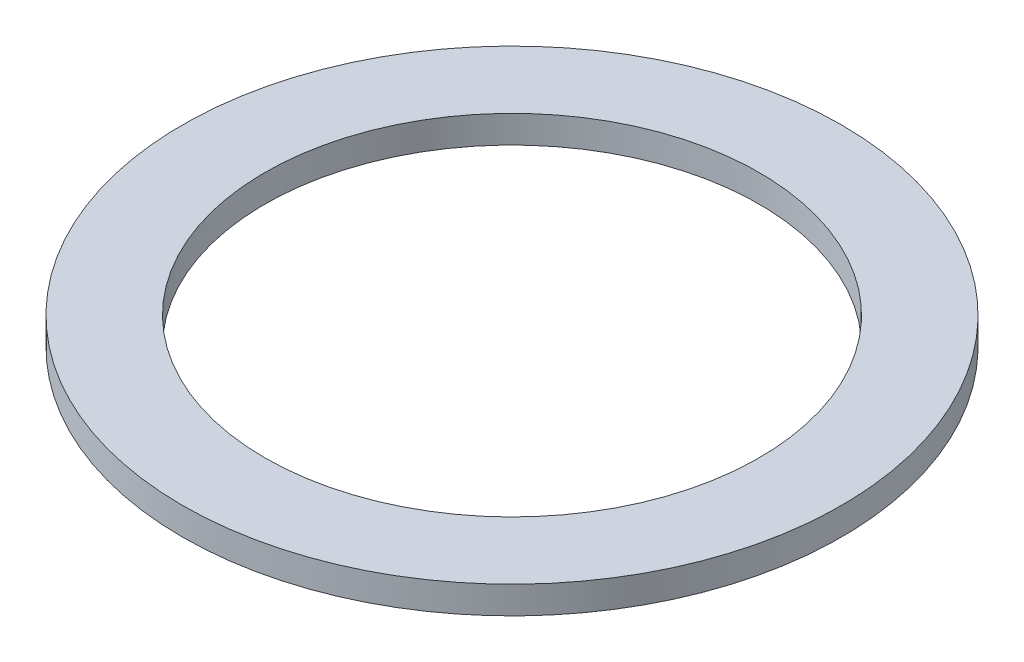
ISO-10303-21;
HEADER;
FILE_DESCRIPTION(('STEP AP214'),'2;1');
FILE_NAME('part.step','',(''),(''),'','','');
FILE_SCHEMA(('AUTOMOTIVE_DESIGN { 1 0 10303 214 1 1 1 1 }'));
ENDSEC;
DATA;
#1=APPLICATION_CONTEXT('core data for automotive mechanical design processes');
#2=APPLICATION_PROTOCOL_DEFINITION('international standard','automotive_design',2000,#1);
#3=PRODUCT_CONTEXT('',#1,'mechanical');
#4=PRODUCT('Part','Part','',(#3));
#5=PRODUCT_RELATED_PRODUCT_CATEGORY('part','',(#4));
#6=PRODUCT_DEFINITION_FORMATION('','',#4);
#7=PRODUCT_DEFINITION_CONTEXT('part definition',#1,'design');
#8=PRODUCT_DEFINITION('design','',#6,#7);
#9=PRODUCT_DEFINITION_SHAPE('','',#8);
#10=(LENGTH_UNIT() NAMED_UNIT(*) SI_UNIT(.MILLI.,.METRE.));
#11=(NAMED_UNIT(*) PLANE_ANGLE_UNIT() SI_UNIT($,.RADIAN.));
#12=(NAMED_UNIT(*) SI_UNIT($,.STERADIAN.) SOLID_ANGLE_UNIT());
#13=UNCERTAINTY_MEASURE_WITH_UNIT(LENGTH_MEASURE(1.E-05),#10,'distance_accuracy_value','');
#14=(GEOMETRIC_REPRESENTATION_CONTEXT(3) GLOBAL_UNCERTAINTY_ASSIGNED_CONTEXT((#13)) GLOBAL_UNIT_ASSIGNED_CONTEXT((#10,
#11,#12)) REPRESENTATION_CONTEXT('',''));
#15=CARTESIAN_POINT('',(0.,0.,0.));
#16=DIRECTION('',(0.,0.,1.));
#17=DIRECTION('',(1.,0.,0.));
#18=AXIS2_PLACEMENT_3D('',#15,#16,#17);
#19=CARTESIAN_POINT('',(0.,2.,0.));
#20=DIRECTION('',(0.,1.,0.));
#21=DIRECTION('',(0.,0.,1.));
#22=AXIS2_PLACEMENT_3D('',#19,#20,#21);
#23=PLANE('',#22);
#24=CARTESIAN_POINT('',(0.,2.,0.));
#25=DIRECTION('',(0.,1.,0.));
#26=DIRECTION('',(0.,0.,1.));
#27=AXIS2_PLACEMENT_3D('',#24,#25,#26);
#28=CIRCLE('',#27,24.);
#29=CARTESIAN_POINT('',(0.,2.,24.));
#30=VERTEX_POINT('',#29);
#31=EDGE_CURVE('E10',#30,#30,#28,.T.);
#32=ORIENTED_EDGE('',*,*,#31,.T.);
#33=EDGE_LOOP('',(#32));
#34=FACE_BOUND('',#33,.T.);
#35=CARTESIAN_POINT('',(0.,2.,0.));
#36=DIRECTION('',(0.,1.,0.));
#37=DIRECTION('',(0.,0.,1.));
#38=AXIS2_PLACEMENT_3D('',#35,#36,#37);
#39=CIRCLE('',#38,18.);
#40=CARTESIAN_POINT('',(0.,2.,18.));
#41=VERTEX_POINT('',#40);
#42=EDGE_CURVE('E43',#41,#41,#39,.T.);
#43=ORIENTED_EDGE('',*,*,#42,.F.);
#44=EDGE_LOOP('',(#43));
#45=FACE_BOUND('',#44,.T.);
#46=ADVANCED_FACE('F32',(#34,#45),#23,.T.);
#47=CARTESIAN_POINT('',(0.,0.,0.));
#48=DIRECTION('',(0.,1.,0.));
#49=DIRECTION('',(0.,0.,1.));
#50=AXIS2_PLACEMENT_3D('',#47,#48,#49);
#51=PLANE('',#50);
#52=CARTESIAN_POINT('',(0.,0.,0.));
#53=DIRECTION('',(0.,1.,0.));
#54=DIRECTION('',(0.,0.,1.));
#55=AXIS2_PLACEMENT_3D('',#52,#53,#54);
#56=CIRCLE('',#55,24.);
#57=CARTESIAN_POINT('',(0.,0.,24.));
#58=VERTEX_POINT('',#57);
#59=EDGE_CURVE('E36',#58,#58,#56,.T.);
#60=ORIENTED_EDGE('',*,*,#59,.F.);
#61=EDGE_LOOP('',(#60));
#62=FACE_BOUND('',#61,.T.);
#63=CARTESIAN_POINT('',(0.,0.,0.));
#64=DIRECTION('',(0.,1.,0.));
#65=DIRECTION('',(0.,0.,1.));
#66=AXIS2_PLACEMENT_3D('',#63,#64,#65);
#67=CIRCLE('',#66,18.);
#68=CARTESIAN_POINT('',(0.,0.,18.));
#69=VERTEX_POINT('',#68);
#70=EDGE_CURVE('E45',#69,#69,#67,.T.);
#71=ORIENTED_EDGE('',*,*,#70,.T.);
#72=EDGE_LOOP('',(#71));
#73=FACE_BOUND('',#72,.T.);
#74=ADVANCED_FACE('F55',(#62,#73),#51,.F.);
#75=CARTESIAN_POINT('',(0.,2.,0.));
#76=DIRECTION('',(0.,-1.,0.));
#77=DIRECTION('',(0.,0.,-1.));
#78=AXIS2_PLACEMENT_3D('',#75,#76,#77);
#79=CYLINDRICAL_SURFACE('',#78,24.);
#80=ORIENTED_EDGE('',*,*,#31,.F.);
#81=EDGE_LOOP('',(#80));
#82=FACE_BOUND('',#81,.T.);
#83=ORIENTED_EDGE('',*,*,#59,.T.);
#84=EDGE_LOOP('',(#83));
#85=FACE_BOUND('',#84,.T.);
#86=ADVANCED_FACE('F34',(#82,#85),#79,.T.);
#87=CARTESIAN_POINT('',(0.,2.,0.));
#88=DIRECTION('',(0.,-1.,0.));
#89=DIRECTION('',(0.,0.,-1.));
#90=AXIS2_PLACEMENT_3D('',#87,#88,#89);
#91=CYLINDRICAL_SURFACE('',#90,18.);
#92=ORIENTED_EDGE('',*,*,#42,.T.);
#93=EDGE_LOOP('',(#92));
#94=FACE_BOUND('',#93,.T.);
#95=ORIENTED_EDGE('',*,*,#70,.F.);
#96=EDGE_LOOP('',(#95));
#97=FACE_BOUND('',#96,.T.);
#98=ADVANCED_FACE('F51',(#94,#97),#91,.F.);
#99=CLOSED_SHELL('',(#46,#74,#86,#98));
#100=MANIFOLD_SOLID_BREP('B2',#99);
#101=ADVANCED_BREP_SHAPE_REPRESENTATION('',(#18,#100),#14);
#102=SHAPE_DEFINITION_REPRESENTATION(#9,#101);
ENDSEC;
END-ISO-10303-21;
